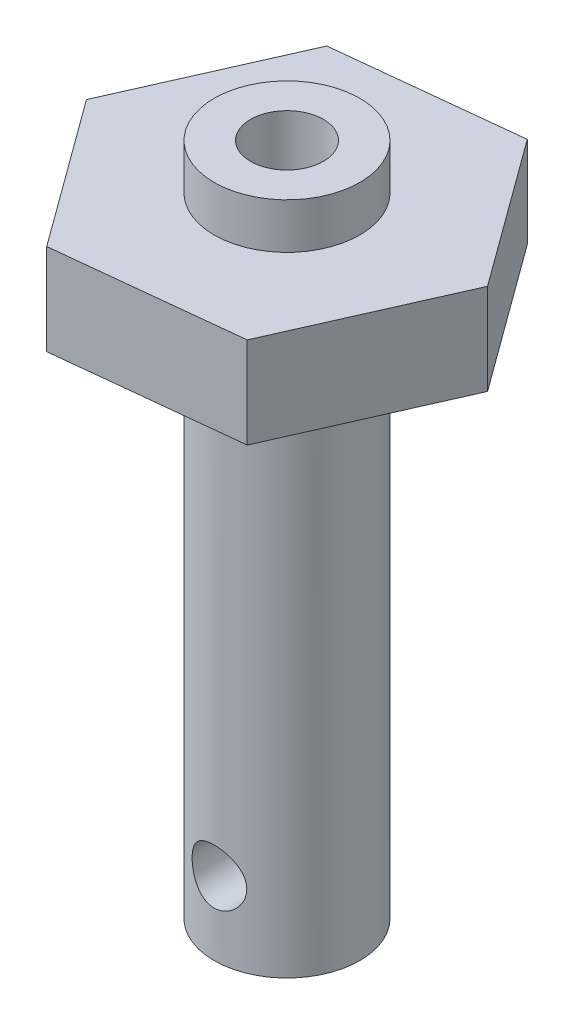
ISO-10303-21;
HEADER;
FILE_DESCRIPTION(('STEP AP214'),'2;1');
FILE_NAME('part.step','',(''),(''),'','','');
FILE_SCHEMA(('AUTOMOTIVE_DESIGN { 1 0 10303 214 1 1 1 1 }'));
ENDSEC;
DATA;
#1=APPLICATION_CONTEXT('core data for automotive mechanical design processes');
#2=APPLICATION_PROTOCOL_DEFINITION('international standard','automotive_design',2000,#1);
#3=PRODUCT_CONTEXT('',#1,'mechanical');
#4=PRODUCT('Part','Part','',(#3));
#5=PRODUCT_RELATED_PRODUCT_CATEGORY('part','',(#4));
#6=PRODUCT_DEFINITION_FORMATION('','',#4);
#7=PRODUCT_DEFINITION_CONTEXT('part definition',#1,'design');
#8=PRODUCT_DEFINITION('design','',#6,#7);
#9=PRODUCT_DEFINITION_SHAPE('','',#8);
#10=(LENGTH_UNIT() NAMED_UNIT(*) SI_UNIT(.MILLI.,.METRE.));
#11=(NAMED_UNIT(*) PLANE_ANGLE_UNIT() SI_UNIT($,.RADIAN.));
#12=(NAMED_UNIT(*) SI_UNIT($,.STERADIAN.) SOLID_ANGLE_UNIT());
#13=UNCERTAINTY_MEASURE_WITH_UNIT(LENGTH_MEASURE(1.E-05),#10,'distance_accuracy_value','');
#14=(GEOMETRIC_REPRESENTATION_CONTEXT(3) GLOBAL_UNCERTAINTY_ASSIGNED_CONTEXT((#13)) GLOBAL_UNIT_ASSIGNED_CONTEXT((#10,
#11,#12)) REPRESENTATION_CONTEXT('',''));
#15=CARTESIAN_POINT('',(0.,0.,0.));
#16=DIRECTION('',(0.,0.,1.));
#17=DIRECTION('',(1.,0.,0.));
#18=AXIS2_PLACEMENT_3D('',#15,#16,#17);
#19=CARTESIAN_POINT('',(0.,8.50000000000005,0.));
#20=DIRECTION('',(0.,1.,0.));
#21=DIRECTION('',(0.,0.,1.));
#22=AXIS2_PLACEMENT_3D('',#19,#20,#21);
#23=CYLINDRICAL_SURFACE('',#22,3.99999999999993);
#24=CARTESIAN_POINT('',(0.,29.5,0.));
#25=DIRECTION('',(0.,-1.,0.));
#26=DIRECTION('',(1.,0.,0.));
#27=AXIS2_PLACEMENT_3D('',#24,#25,#26);
#28=CIRCLE('',#27,3.99999999999993);
#29=CARTESIAN_POINT('',(3.99999999999993,29.5000000000001,0.));
#30=VERTEX_POINT('',#29);
#31=EDGE_CURVE('E12',#30,#30,#28,.F.);
#32=ORIENTED_EDGE('',*,*,#31,.F.);
#33=EDGE_LOOP('',(#32));
#34=FACE_BOUND('',#33,.T.);
#35=CARTESIAN_POINT('',(1.5,4.,-3.70809924354782));
#36=CARTESIAN_POINT('',(1.50000304106109,3.91899251627921,-3.70809640633805));
#37=CARTESIAN_POINT('',(1.49341597549487,3.83800507749636,-3.71078260240985));
#38=CARTESIAN_POINT('',(1.46736187895468,3.6784719170868,-3.72116159304966));
#39=CARTESIAN_POINT('',(1.44789523373263,3.59992612240499,-3.72885423767111));
#40=CARTESIAN_POINT('',(1.39689657610574,3.44762462838647,-3.74825480280899));
#41=CARTESIAN_POINT('',(1.36539347266348,3.37385794334892,-3.75995309569259));
#42=CARTESIAN_POINT('',(1.29131856742698,3.23262810318116,-3.78603134206598));
#43=CARTESIAN_POINT('',(1.24874344095039,3.16516684971748,-3.80041210067322));
#44=CARTESIAN_POINT('',(1.15146661374162,3.03510968837718,-3.83103574665712));
#45=CARTESIAN_POINT('',(1.09630381213306,2.97287147037061,-3.84733341923603));
#46=CARTESIAN_POINT('',(0.976395839778926,2.85827718532851,-3.87949750628546));
#47=CARTESIAN_POINT('',(0.91164863025668,2.80592322625815,-3.89536382814784));
#48=CARTESIAN_POINT('',(0.7716946551776,2.71086048770439,-3.92552873936552));
#49=CARTESIAN_POINT('',(0.696206947538028,2.66854052528414,-3.93975561223505));
#50=CARTESIAN_POINT('',(0.538555771965247,2.59734882747509,-3.96438007973847));
#51=CARTESIAN_POINT('',(0.456394630933536,2.56847242800803,-3.97477900217005));
#52=CARTESIAN_POINT('',(0.291489341676832,2.52624210422538,-3.99018697103439));
#53=CARTESIAN_POINT('',(0.208923197281596,2.51227237255954,-3.99540915214773));
#54=CARTESIAN_POINT('',(0.0424643637947859,2.49827879905501,-4.00064014107939));
#55=CARTESIAN_POINT('',(-0.0414278850628332,2.49825042238129,-4.00065064414901));
#56=CARTESIAN_POINT('',(-0.203743543064476,2.51178176146517,-3.99559265903893));
#57=CARTESIAN_POINT('',(-0.2822321782669,2.52466929794881,-3.99077541996682));
#58=CARTESIAN_POINT('',(-0.435839217984391,2.56253591522555,-3.97693274932262));
#59=CARTESIAN_POINT('',(-0.510957383430299,2.58751585226204,-3.96790701975577));
#60=CARTESIAN_POINT('',(-0.656989017303104,2.64917045167585,-3.9463776916753));
#61=CARTESIAN_POINT('',(-0.727825392287309,2.68601000526841,-3.93382539470076));
#62=CARTESIAN_POINT('',(-0.862486607957559,2.77019209692939,-3.90651310225278));
#63=CARTESIAN_POINT('',(-0.926309176932323,2.8175380230176,-3.89175239512839));
#64=CARTESIAN_POINT('',(-1.04909048680094,2.92462728628319,-3.86052529655815));
#65=CARTESIAN_POINT('',(-1.10754614526348,2.98493391565043,-3.84400963763882));
#66=CARTESIAN_POINT('',(-1.21370395569342,3.11459299332156,-3.81182460645721));
#67=CARTESIAN_POINT('',(-1.261403406929,3.18394770658664,-3.79615544748846));
#68=CARTESIAN_POINT('',(-1.34565611808152,3.33171946746282,-3.76712703500335));
#69=CARTESIAN_POINT('',(-1.38193847851831,3.41030349368607,-3.75382677150276));
#70=CARTESIAN_POINT('',(-1.44056464441501,3.57309622516757,-3.73172438629002));
#71=CARTESIAN_POINT('',(-1.46291620605595,3.65730177159369,-3.72291976205782));
#72=CARTESIAN_POINT('',(-1.49190191709668,3.82397596231595,-3.71139597222848));
#73=CARTESIAN_POINT('',(-1.49933521158966,3.90628410553614,-3.70836785241536));
#74=CARTESIAN_POINT('',(-1.50057885636272,4.07100935674174,-3.70786539525015));
#75=CARTESIAN_POINT('',(-1.49439261093762,4.15342643235247,-3.71038967003986));
#76=CARTESIAN_POINT('',(-1.46929733520157,4.31192992228768,-3.72039381629734));
#77=CARTESIAN_POINT('',(-1.45100618334225,4.38813113576466,-3.72763276216448));
#78=CARTESIAN_POINT('',(-1.40299774640637,4.5363479447202,-3.74596487046361));
#79=CARTESIAN_POINT('',(-1.37327812034623,4.60836267916814,-3.75705882250172));
#80=CARTESIAN_POINT('',(-1.30200292275278,4.74916443807621,-3.78236243116079));
#81=CARTESIAN_POINT('',(-1.26004545177047,4.81772929213734,-3.79667328892064));
#82=CARTESIAN_POINT('',(-1.16591317862479,4.94712898172604,-3.8266281429429));
#83=CARTESIAN_POINT('',(-1.11373463696435,5.00796097462463,-3.84227262594076));
#84=CARTESIAN_POINT('',(-0.996727340900938,5.1241683731951,-3.87433046553183));
#85=CARTESIAN_POINT('',(-0.931306341491061,5.17895340876875,-3.89072969357027));
#86=CARTESIAN_POINT('',(-0.79179747175315,5.27683836758944,-3.92149874963301));
#87=CARTESIAN_POINT('',(-0.717709573322673,5.31993825294584,-3.93586857107663));
#88=CARTESIAN_POINT('',(-0.563016329468476,5.39294605619961,-3.96094985704551));
#89=CARTESIAN_POINT('',(-0.482434433064626,5.4228991237926,-3.97167381338009));
#90=CARTESIAN_POINT('',(-0.316881887523255,5.46865641384992,-3.9882943671257));
#91=CARTESIAN_POINT('',(-0.231913320723592,5.4844672854224,-3.99419323299412));
#92=CARTESIAN_POINT('',(-0.0653355852738149,5.50077440275483,-4.00028407317073));
#93=CARTESIAN_POINT('',(0.016180768060846,5.50210948305899,-4.00078860953763));
#94=CARTESIAN_POINT('',(0.178226786412424,5.49158484055461,-3.99684889809223));
#95=CARTESIAN_POINT('',(0.258756569245258,5.47972670911414,-3.99240524713129));
#96=CARTESIAN_POINT('',(0.414548248377126,5.44374114850638,-3.9792108960377));
#97=CARTESIAN_POINT('',(0.489890731068835,5.41992009412164,-3.97056791378017));
#98=CARTESIAN_POINT('',(0.63551547300639,5.36098998661564,-3.94987783620989));
#99=CARTESIAN_POINT('',(0.705796771275543,5.32587879669525,-3.93783009655663));
#100=CARTESIAN_POINT('',(0.842540176994413,5.24368605649519,-3.91090618300073));
#101=CARTESIAN_POINT('',(0.90871754884685,5.19616335948585,-3.89593240108828));
#102=CARTESIAN_POINT('',(1.03241734752336,5.09119216981239,-3.86499507694843));
#103=CARTESIAN_POINT('',(1.0899366712559,5.03374013419213,-3.84903118274026));
#104=CARTESIAN_POINT('',(1.19781214236196,4.90693586835494,-3.81688129739174));
#105=CARTESIAN_POINT('',(1.24762999816025,4.83711559784569,-3.80072805349159));
#106=CARTESIAN_POINT('',(1.33484709556843,4.68958413042667,-3.77098325003637));
#107=CARTESIAN_POINT('',(1.37224504878157,4.61187211594652,-3.75739195631216));
#108=CARTESIAN_POINT('',(1.4346588697426,4.44704431902459,-3.73402269853265));
#109=CARTESIAN_POINT('',(1.45906002899523,4.35966563348821,-3.72443803290859));
#110=CARTESIAN_POINT('',(1.49172356722079,4.18151472804421,-3.71147994336314));
#111=CARTESIAN_POINT('',(1.49999659339571,4.09074478729001,-3.70810242179735));
#112=CARTESIAN_POINT('',(1.5,4.,-3.70809924354782));
#113=B_SPLINE_CURVE_WITH_KNOTS('',3,(#35,#36,#37,#38,#39,#40,#41,#42,#43,#44,#45,#46,#47,#48,
#49,#50,#51,#52,#53,#54,#55,#56,#57,#58,#59,#60,#61,#62,#63,#64,#65,#66,#67,#68,#69,#70,#71,#72,
#73,#74,#75,#76,#77,#78,#79,#80,#81,#82,#83,#84,#85,#86,#87,#88,#89,#90,#91,#92,#93,#94,#95,#96,
#97,#98,#99,#100,#101,#102,#103,#104,#105,#106,#107,#108,#109,#110,#111,#112),.UNSPECIFIED.,.T.,
.F.,(4,2,2,2,2,2,2,2,2,2,2,2,2,2,2,2,2,2,2,2,2,2,2,2,2,2,2,2,2,2,2,2,2,2,2,2,2,2,4),(0.,
0.24268454141617,0.485361814598854,0.72745985675703,0.969630679682933,1.22274652401128,
1.47591628822983,1.73770072136421,1.9993942638133,2.24980018489679,2.50012465404857,
2.73806472803194,2.97602165263335,3.21744131210668,3.45893893628976,3.71456675065874,
3.97025867827335,4.23162592252966,4.49284751635474,4.73965657740485,4.98640395388884,
5.22143845928199,5.45652113429526,5.70041561005821,5.94439948466355,6.20385016993624,
6.46330169650178,6.72185508890168,6.98028685560127,7.22365720549936,7.4669982031948,
7.7044027400389,7.94185223512831,8.18928323676987,8.43680270894964,8.69738599542079,
8.95799630544242,9.23003178870926,9.50188762323053),.UNSPECIFIED.);
#114=CARTESIAN_POINT('',(1.5,4.,-3.70809924354782));
#115=VERTEX_POINT('',#114);
#116=EDGE_CURVE('E177',#115,#115,#113,.T.);
#117=ORIENTED_EDGE('',*,*,#116,.F.);
#118=EDGE_LOOP('',(#117));
#119=FACE_BOUND('',#118,.T.);
#120=CARTESIAN_POINT('',(1.5,4.,3.70809924354783));
#121=CARTESIAN_POINT('',(1.50000304106109,4.08100748372079,3.70809640633806));
#122=CARTESIAN_POINT('',(1.49341597549487,4.16199492250364,3.71078260240986));
#123=CARTESIAN_POINT('',(1.46736187895468,4.3215280829132,3.72116159304967));
#124=CARTESIAN_POINT('',(1.44789523373263,4.40007387759501,3.72885423767112));
#125=CARTESIAN_POINT('',(1.39689657610574,4.55237537161353,3.748254802809));
#126=CARTESIAN_POINT('',(1.36539347266348,4.62614205665108,3.7599530956926));
#127=CARTESIAN_POINT('',(1.29131856742698,4.76737189681884,3.78603134206598));
#128=CARTESIAN_POINT('',(1.24874344095039,4.83483315028252,3.80041210067323));
#129=CARTESIAN_POINT('',(1.15146661374162,4.96489031162282,3.83103574665713));
#130=CARTESIAN_POINT('',(1.09630381213306,5.02712852962939,3.84733341923603));
#131=CARTESIAN_POINT('',(0.976395839778926,5.14172281467149,3.87949750628547));
#132=CARTESIAN_POINT('',(0.911648630256679,5.19407677374186,3.89536382814785));
#133=CARTESIAN_POINT('',(0.771694655177599,5.28913951229561,3.92552873936553));
#134=CARTESIAN_POINT('',(0.696206947538027,5.33145947471586,3.93975561223505));
#135=CARTESIAN_POINT('',(0.538555771965246,5.40265117252491,3.96438007973847));
#136=CARTESIAN_POINT('',(0.456394630933535,5.43152757199197,3.97477900217006));
#137=CARTESIAN_POINT('',(0.291489341676831,5.47375789577462,3.99018697103439));
#138=CARTESIAN_POINT('',(0.208923197281595,5.48772762744046,3.99540915214774));
#139=CARTESIAN_POINT('',(0.0424643637947849,5.50172120094499,4.0006401410794));
#140=CARTESIAN_POINT('',(-0.0414278850628341,5.50174957761871,4.00065064414902));
#141=CARTESIAN_POINT('',(-0.203743543064477,5.48821823853483,3.99559265903894));
#142=CARTESIAN_POINT('',(-0.282232178266901,5.47533070205118,3.99077541996683));
#143=CARTESIAN_POINT('',(-0.435839217984392,5.43746408477445,3.97693274932263));
#144=CARTESIAN_POINT('',(-0.510957383430299,5.41248414773796,3.96790701975577));
#145=CARTESIAN_POINT('',(-0.656989017303105,5.35082954832415,3.9463776916753));
#146=CARTESIAN_POINT('',(-0.72782539228731,5.31398999473159,3.93382539470077));
#147=CARTESIAN_POINT('',(-0.86248660795756,5.22980790307061,3.90651310225279));
#148=CARTESIAN_POINT('',(-0.926309176932323,5.1824619769824,3.8917523951284));
#149=CARTESIAN_POINT('',(-1.04909048680094,5.07537271371681,3.86052529655816));
#150=CARTESIAN_POINT('',(-1.10754614526348,5.01506608434957,3.84400963763882));
#151=CARTESIAN_POINT('',(-1.21370395569342,4.88540700667844,3.81182460645722));
#152=CARTESIAN_POINT('',(-1.261403406929,4.81605229341336,3.79615544748847));
#153=CARTESIAN_POINT('',(-1.34565611808152,4.66828053253718,3.76712703500335));
#154=CARTESIAN_POINT('',(-1.38193847851831,4.58969650631393,3.75382677150276));
#155=CARTESIAN_POINT('',(-1.44056464441501,4.42690377483243,3.73172438629002));
#156=CARTESIAN_POINT('',(-1.46291620605595,4.34269822840631,3.72291976205783));
#157=CARTESIAN_POINT('',(-1.49190191709668,4.17602403768405,3.71139597222848));
#158=CARTESIAN_POINT('',(-1.49933521158966,4.09371589446386,3.70836785241537));
#159=CARTESIAN_POINT('',(-1.50057885636272,3.92899064325826,3.70786539525016));
#160=CARTESIAN_POINT('',(-1.49439261093762,3.84657356764753,3.71038967003986));
#161=CARTESIAN_POINT('',(-1.46929733520157,3.68807007771232,3.72039381629735));
#162=CARTESIAN_POINT('',(-1.45100618334225,3.61186886423534,3.72763276216449));
#163=CARTESIAN_POINT('',(-1.40299774640637,3.46365205527981,3.74596487046362));
#164=CARTESIAN_POINT('',(-1.37327812034623,3.39163732083186,3.75705882250173));
#165=CARTESIAN_POINT('',(-1.30200292275278,3.25083556192379,3.78236243116079));
#166=CARTESIAN_POINT('',(-1.26004545177047,3.18227070786266,3.79667328892065));
#167=CARTESIAN_POINT('',(-1.16591317862479,3.05287101827396,3.82662814294291));
#168=CARTESIAN_POINT('',(-1.11373463696435,2.99203902537537,3.84227262594077));
#169=CARTESIAN_POINT('',(-0.996727340900938,2.8758316268049,3.87433046553184));
#170=CARTESIAN_POINT('',(-0.931306341491061,2.82104659123125,3.89072969357027));
#171=CARTESIAN_POINT('',(-0.791797471753151,2.72316163241056,3.92149874963302));
#172=CARTESIAN_POINT('',(-0.717709573322673,2.68006174705416,3.93586857107664));
#173=CARTESIAN_POINT('',(-0.563016329468477,2.60705394380039,3.96094985704552));
#174=CARTESIAN_POINT('',(-0.482434433064626,2.5771008762074,3.9716738133801));
#175=CARTESIAN_POINT('',(-0.316881887523254,2.53134358615008,3.98829436712571));
#176=CARTESIAN_POINT('',(-0.231913320723593,2.5155327145776,3.99419323299412));
#177=CARTESIAN_POINT('',(-0.0653355852738154,2.49922559724517,4.00028407317073));
#178=CARTESIAN_POINT('',(0.0161807680608454,2.49789051694101,4.00078860953764));
#179=CARTESIAN_POINT('',(0.178226786412424,2.50841515944539,3.99684889809223));
#180=CARTESIAN_POINT('',(0.258756569245257,2.52027329088586,3.9924052471313));
#181=CARTESIAN_POINT('',(0.414548248377126,2.55625885149362,3.97921089603771));
#182=CARTESIAN_POINT('',(0.489890731068834,2.58007990587836,3.97056791378017));
#183=CARTESIAN_POINT('',(0.63551547300639,2.63901001338436,3.9498778362099));
#184=CARTESIAN_POINT('',(0.705796771275542,2.67412120330475,3.93783009655664));
#185=CARTESIAN_POINT('',(0.842540176994412,2.75631394350481,3.91090618300074));
#186=CARTESIAN_POINT('',(0.908717548846849,2.80383664051415,3.89593240108828));
#187=CARTESIAN_POINT('',(1.03241734752336,2.9088078301876,3.86499507694844));
#188=CARTESIAN_POINT('',(1.0899366712559,2.96625986580787,3.84903118274027));
#189=CARTESIAN_POINT('',(1.19781214236196,3.09306413164506,3.81688129739175));
#190=CARTESIAN_POINT('',(1.24762999816025,3.16288440215431,3.8007280534916));
#191=CARTESIAN_POINT('',(1.33484709556843,3.31041586957333,3.77098325003638));
#192=CARTESIAN_POINT('',(1.37224504878157,3.38812788405348,3.75739195631216));
#193=CARTESIAN_POINT('',(1.4346588697426,3.55295568097541,3.73402269853266));
#194=CARTESIAN_POINT('',(1.45906002899523,3.64033436651178,3.7244380329086));
#195=CARTESIAN_POINT('',(1.49172356722079,3.81848527195579,3.71147994336315));
#196=CARTESIAN_POINT('',(1.49999659339571,3.90925521270999,3.70810242179736));
#197=CARTESIAN_POINT('',(1.5,4.,3.70809924354783));
#198=B_SPLINE_CURVE_WITH_KNOTS('',3,(#120,#121,#122,#123,#124,#125,#126,#127,#128,#129,#130,
#131,#132,#133,#134,#135,#136,#137,#138,#139,#140,#141,#142,#143,#144,#145,#146,#147,#148,#149,
#150,#151,#152,#153,#154,#155,#156,#157,#158,#159,#160,#161,#162,#163,#164,#165,#166,#167,#168,
#169,#170,#171,#172,#173,#174,#175,#176,#177,#178,#179,#180,#181,#182,#183,#184,#185,#186,#187,
#188,#189,#190,#191,#192,#193,#194,#195,#196,#197),.UNSPECIFIED.,.T.,.F.,(4,2,2,2,2,2,2,2,2,2,2,
2,2,2,2,2,2,2,2,2,2,2,2,2,2,2,2,2,2,2,2,2,2,2,2,2,2,2,4),(0.,0.24268454141617,0.485361814598855,
0.727459856757031,0.969630679682934,1.22274652401128,1.47591628822983,1.73770072136421,
1.9993942638133,2.24980018489679,2.50012465404857,2.73806472803194,2.97602165263335,
3.21744131210668,3.45893893628976,3.71456675065874,3.97025867827335,4.23162592252966,
4.49284751635474,4.73965657740485,4.98640395388884,5.22143845928199,5.45652113429526,
5.70041561005821,5.94439948466355,6.20385016993624,6.46330169650178,6.72185508890169,
6.98028685560127,7.22365720549936,7.4669982031948,7.70440274003891,7.94185223512831,
8.18928323676987,8.43680270894965,8.69738599542079,8.95799630544242,9.23003178870926,
9.50188762323053),.UNSPECIFIED.);
#199=CARTESIAN_POINT('',(1.5,4.,3.70809924354783));
#200=VERTEX_POINT('',#199);
#201=EDGE_CURVE('E180',#200,#200,#198,.T.);
#202=ORIENTED_EDGE('',*,*,#201,.F.);
#203=EDGE_LOOP('',(#202));
#204=FACE_BOUND('',#203,.T.);
#205=CARTESIAN_POINT('',(0.,0.,0.));
#206=DIRECTION('',(0.,1.,0.));
#207=DIRECTION('',(0.,0.,1.));
#208=AXIS2_PLACEMENT_3D('',#205,#206,#207);
#209=CIRCLE('',#208,4.);
#210=CARTESIAN_POINT('',(0.,0.,4.));
#211=VERTEX_POINT('',#210);
#212=EDGE_CURVE('E186',#211,#211,#209,.T.);
#213=ORIENTED_EDGE('',*,*,#212,.T.);
#214=EDGE_LOOP('',(#213));
#215=FACE_BOUND('',#214,.T.);
#216=ADVANCED_FACE('F33',(#34,#119,#204,#215),#23,.T.);
#217=CARTESIAN_POINT('',(5.8949322334674,2.48324532484363,8.07773321933895));
#218=DIRECTION('',(-0.106629445810112,0.,-0.994298828967544));
#219=DIRECTION('',(-0.994298828967544,0.,0.106629445810112));
#220=AXIS2_PLACEMENT_3D('',#217,#218,#219);
#221=PLANE('',#220);
#222=DIRECTION('',(-0.994298828967544,0.,0.106629445810112));
#223=VECTOR('',#222,1.);
#224=CARTESIAN_POINT('',(5.89493223346735,29.5000000000001,8.07773321933897));
#225=LINE('',#224,#223);
#226=CARTESIAN_POINT('',(5.89493223346741,29.5000000000001,8.07773321933896));
#227=VERTEX_POINT('',#226);
#228=CARTESIAN_POINT('',(-4.04805605620728,29.5,9.14402767744));
#229=VERTEX_POINT('',#228);
#230=EDGE_CURVE('E144',#227,#229,#225,.T.);
#231=ORIENTED_EDGE('',*,*,#230,.F.);
#232=DIRECTION('',(0.,1.,0.));
#233=VECTOR('',#232,1.);
#234=CARTESIAN_POINT('',(5.8949322334674,2.48324532484363,8.07773321933895));
#235=LINE('',#234,#233);
#236=CARTESIAN_POINT('',(5.8949322334674,34.5,8.07773321933896));
#237=VERTEX_POINT('',#236);
#238=EDGE_CURVE('E131',#227,#237,#235,.T.);
#239=ORIENTED_EDGE('',*,*,#238,.T.);
#240=DIRECTION('',(-0.994298828967544,0.,0.106629445810112));
#241=VECTOR('',#240,1.);
#242=CARTESIAN_POINT('',(5.8949322334674,34.5,8.07773321933896));
#243=LINE('',#242,#241);
#244=CARTESIAN_POINT('',(-4.04805605620728,34.5,9.14402767744));
#245=VERTEX_POINT('',#244);
#246=EDGE_CURVE('E99',#237,#245,#243,.T.);
#247=ORIENTED_EDGE('',*,*,#246,.T.);
#248=DIRECTION('',(0.,1.,0.));
#249=VECTOR('',#248,1.);
#250=CARTESIAN_POINT('',(-4.04805605620728,2.48324532484363,9.14402767743999));
#251=LINE('',#250,#249);
#252=EDGE_CURVE('E129',#229,#245,#251,.T.);
#253=ORIENTED_EDGE('',*,*,#252,.F.);
#254=EDGE_LOOP('',(#231,#239,#247,#253));
#255=FACE_BOUND('',#254,.T.);
#256=ADVANCED_FACE('F234',(#255),#221,.F.);
#257=CARTESIAN_POINT('',(-4.04805605620728,2.48324532484363,9.14402767743999));
#258=DIRECTION('',(0.807773321933956,0.,-0.589493223346785));
#259=DIRECTION('',(-0.589493223346785,0.,-0.807773321933956));
#260=AXIS2_PLACEMENT_3D('',#257,#258,#259);
#261=PLANE('',#260);
#262=DIRECTION('',(-0.589493223346785,0.,-0.807773321933956));
#263=VECTOR('',#262,1.);
#264=CARTESIAN_POINT('',(-4.0480560562073,29.5,9.14402767743997));
#265=LINE('',#264,#263);
#266=CARTESIAN_POINT('',(-9.94298828967469,29.5,1.06629445810105));
#267=VERTEX_POINT('',#266);
#268=EDGE_CURVE('E141',#229,#267,#265,.T.);
#269=ORIENTED_EDGE('',*,*,#268,.F.);
#270=ORIENTED_EDGE('',*,*,#252,.T.);
#271=DIRECTION('',(-0.589493223346785,0.,-0.807773321933956));
#272=VECTOR('',#271,1.);
#273=CARTESIAN_POINT('',(-4.04805605620728,34.5,9.14402767744));
#274=LINE('',#273,#272);
#275=CARTESIAN_POINT('',(-9.94298828967469,34.5,1.06629445810105));
#276=VERTEX_POINT('',#275);
#277=EDGE_CURVE('E126',#245,#276,#274,.T.);
#278=ORIENTED_EDGE('',*,*,#277,.T.);
#279=DIRECTION('',(0.,1.,0.));
#280=VECTOR('',#279,1.);
#281=CARTESIAN_POINT('',(-9.94298828967469,2.48324532484363,1.06629445810104));
#282=LINE('',#281,#280);
#283=EDGE_CURVE('E125',#267,#276,#282,.T.);
#284=ORIENTED_EDGE('',*,*,#283,.F.);
#285=EDGE_LOOP('',(#269,#270,#278,#284));
#286=FACE_BOUND('',#285,.T.);
#287=ADVANCED_FACE('F230',(#286),#261,.F.);
#288=CARTESIAN_POINT('',(-9.94298828967469,2.48324532484363,1.06629445810104));
#289=DIRECTION('',(0.914402767744067,0.,0.404805605620759));
#290=DIRECTION('',(0.404805605620759,0.,-0.914402767744067));
#291=AXIS2_PLACEMENT_3D('',#288,#289,#290);
#292=PLANE('',#291);
#293=DIRECTION('',(0.404805605620759,0.,-0.914402767744067));
#294=VECTOR('',#293,1.);
#295=CARTESIAN_POINT('',(-9.9429882896747,29.5,1.06629445810106));
#296=LINE('',#295,#294);
#297=CARTESIAN_POINT('',(-5.89493223346741,29.5,-8.07773321933894));
#298=VERTEX_POINT('',#297);
#299=EDGE_CURVE('E138',#267,#298,#296,.T.);
#300=ORIENTED_EDGE('',*,*,#299,.F.);
#301=ORIENTED_EDGE('',*,*,#283,.T.);
#302=DIRECTION('',(0.404805605620759,0.,-0.914402767744067));
#303=VECTOR('',#302,1.);
#304=CARTESIAN_POINT('',(-9.94298828967469,34.5,1.06629445810105));
#305=LINE('',#304,#303);
#306=CARTESIAN_POINT('',(-5.89493223346741,34.5,-8.07773321933894));
#307=VERTEX_POINT('',#306);
#308=EDGE_CURVE('E122',#276,#307,#305,.T.);
#309=ORIENTED_EDGE('',*,*,#308,.T.);
#310=DIRECTION('',(0.,1.,0.));
#311=VECTOR('',#310,1.);
#312=CARTESIAN_POINT('',(-5.89493223346741,2.48324532484363,-8.07773321933894));
#313=LINE('',#312,#311);
#314=EDGE_CURVE('E121',#298,#307,#313,.T.);
#315=ORIENTED_EDGE('',*,*,#314,.F.);
#316=EDGE_LOOP('',(#300,#301,#309,#315));
#317=FACE_BOUND('',#316,.T.);
#318=ADVANCED_FACE('F226',(#317),#292,.F.);
#319=CARTESIAN_POINT('',(-5.89493223346741,2.48324532484363,-8.07773321933894));
#320=DIRECTION('',(0.106629445810112,0.,0.994298828967544));
#321=DIRECTION('',(0.994298828967544,0.,-0.106629445810112));
#322=AXIS2_PLACEMENT_3D('',#319,#320,#321);
#323=PLANE('',#322);
#324=DIRECTION('',(0.994298828967544,0.,-0.106629445810112));
#325=VECTOR('',#324,1.);
#326=CARTESIAN_POINT('',(-5.89493223346746,29.5,-8.07773321933893));
#327=LINE('',#326,#325);
#328=CARTESIAN_POINT('',(4.04805605620728,29.5000000000001,-9.14402767743998));
#329=VERTEX_POINT('',#328);
#330=EDGE_CURVE('E135',#298,#329,#327,.T.);
#331=ORIENTED_EDGE('',*,*,#330,.F.);
#332=ORIENTED_EDGE('',*,*,#314,.T.);
#333=DIRECTION('',(0.994298828967544,0.,-0.106629445810112));
#334=VECTOR('',#333,1.);
#335=CARTESIAN_POINT('',(-5.89493223346741,34.5,-8.07773321933894));
#336=LINE('',#335,#334);
#337=CARTESIAN_POINT('',(4.04805605620728,34.5,-9.14402767743998));
#338=VERTEX_POINT('',#337);
#339=EDGE_CURVE('E116',#307,#338,#336,.T.);
#340=ORIENTED_EDGE('',*,*,#339,.T.);
#341=DIRECTION('',(0.,1.,0.));
#342=VECTOR('',#341,1.);
#343=CARTESIAN_POINT('',(4.04805605620728,2.48324532484363,-9.14402767743998));
#344=LINE('',#343,#342);
#345=EDGE_CURVE('E113',#329,#338,#344,.T.);
#346=ORIENTED_EDGE('',*,*,#345,.F.);
#347=EDGE_LOOP('',(#331,#332,#340,#346));
#348=FACE_BOUND('',#347,.T.);
#349=ADVANCED_FACE('F223',(#348),#323,.F.);
#350=CARTESIAN_POINT('',(4.04805605620728,2.48324532484363,-9.14402767743998));
#351=DIRECTION('',(-0.807773321933955,0.,0.589493223346785));
#352=DIRECTION('',(0.589493223346785,0.,0.807773321933955));
#353=AXIS2_PLACEMENT_3D('',#350,#351,#352);
#354=PLANE('',#353);
#355=DIRECTION('',(0.589493223346785,0.,0.807773321933955));
#356=VECTOR('',#355,1.);
#357=CARTESIAN_POINT('',(4.04805605620726,29.5000000000001,-9.14402767744001));
#358=LINE('',#357,#356);
#359=CARTESIAN_POINT('',(9.94298828967469,29.5000000000001,-1.06629445810103));
#360=VERTEX_POINT('',#359);
#361=EDGE_CURVE('E132',#329,#360,#358,.T.);
#362=ORIENTED_EDGE('',*,*,#361,.F.);
#363=ORIENTED_EDGE('',*,*,#345,.T.);
#364=DIRECTION('',(0.589493223346785,0.,0.807773321933955));
#365=VECTOR('',#364,1.);
#366=CARTESIAN_POINT('',(4.04805605620728,34.5,-9.14402767743998));
#367=LINE('',#366,#365);
#368=CARTESIAN_POINT('',(9.94298828967469,34.5,-1.06629445810103));
#369=VERTEX_POINT('',#368);
#370=EDGE_CURVE('E96',#338,#369,#367,.T.);
#371=ORIENTED_EDGE('',*,*,#370,.T.);
#372=DIRECTION('',(0.,1.,0.));
#373=VECTOR('',#372,1.);
#374=CARTESIAN_POINT('',(9.94298828967469,2.48324532484363,-1.06629445810104));
#375=LINE('',#374,#373);
#376=EDGE_CURVE('E103',#360,#369,#375,.T.);
#377=ORIENTED_EDGE('',*,*,#376,.F.);
#378=EDGE_LOOP('',(#362,#363,#371,#377));
#379=FACE_BOUND('',#378,.T.);
#380=ADVANCED_FACE('F111',(#379),#354,.F.);
#381=CARTESIAN_POINT('',(9.94298828967469,2.48324532484363,-1.06629445810104));
#382=DIRECTION('',(-0.914402767744067,0.,-0.404805605620758));
#383=DIRECTION('',(-0.404805605620759,0.,0.914402767744068));
#384=AXIS2_PLACEMENT_3D('',#381,#382,#383);
#385=PLANE('',#384);
#386=DIRECTION('',(-0.404805605620759,0.,0.914402767744068));
#387=VECTOR('',#386,1.);
#388=CARTESIAN_POINT('',(9.94298828967468,29.5000000000001,-1.06629445810101));
#389=LINE('',#388,#387);
#390=EDGE_CURVE('E102',#360,#227,#389,.T.);
#391=ORIENTED_EDGE('',*,*,#390,.F.);
#392=ORIENTED_EDGE('',*,*,#376,.T.);
#393=DIRECTION('',(-0.404805605620758,0.,0.914402767744067));
#394=VECTOR('',#393,1.);
#395=CARTESIAN_POINT('',(9.94298828967469,34.5,-1.06629445810103));
#396=LINE('',#395,#394);
#397=EDGE_CURVE('E92',#369,#237,#396,.T.);
#398=ORIENTED_EDGE('',*,*,#397,.T.);
#399=ORIENTED_EDGE('',*,*,#238,.F.);
#400=EDGE_LOOP('',(#391,#392,#398,#399));
#401=FACE_BOUND('',#400,.T.);
#402=ADVANCED_FACE('F106',(#401),#385,.F.);
#403=CARTESIAN_POINT('',(-1.56015470067894E-13,29.5,0.));
#404=DIRECTION('',(0.,-1.,0.));
#405=DIRECTION('',(-0.000307181244364815,0.,-0.999999952819841));
#406=AXIS2_PLACEMENT_3D('',#403,#404,#405);
#407=PLANE('',#406);
#408=ORIENTED_EDGE('',*,*,#31,.T.);
#409=EDGE_LOOP('',(#408));
#410=FACE_BOUND('',#409,.T.);
#411=ORIENTED_EDGE('',*,*,#390,.T.);
#412=ORIENTED_EDGE('',*,*,#230,.T.);
#413=ORIENTED_EDGE('',*,*,#268,.T.);
#414=ORIENTED_EDGE('',*,*,#299,.T.);
#415=ORIENTED_EDGE('',*,*,#330,.T.);
#416=ORIENTED_EDGE('',*,*,#361,.T.);
#417=EDGE_LOOP('',(#411,#412,#413,#414,#415,#416));
#418=FACE_BOUND('',#417,.T.);
#419=ADVANCED_FACE('F217',(#410,#418),#407,.T.);
#420=CARTESIAN_POINT('',(0.,34.5,0.));
#421=DIRECTION('',(0.,1.,0.));
#422=DIRECTION('',(0.,0.,1.));
#423=AXIS2_PLACEMENT_3D('',#420,#421,#422);
#424=PLANE('',#423);
#425=CARTESIAN_POINT('',(1.5999747025505E-13,34.5,-7.11107768992613E-13));
#426=DIRECTION('',(0.,1.,0.));
#427=DIRECTION('',(0.,0.,1.));
#428=AXIS2_PLACEMENT_3D('',#425,#426,#427);
#429=CIRCLE('',#428,4.);
#430=CARTESIAN_POINT('',(1.5999747025505E-13,34.5,3.99999999999929));
#431=VERTEX_POINT('',#430);
#432=EDGE_CURVE('E155',#431,#431,#429,.T.);
#433=ORIENTED_EDGE('',*,*,#432,.F.);
#434=EDGE_LOOP('',(#433));
#435=FACE_BOUND('',#434,.T.);
#436=ORIENTED_EDGE('',*,*,#246,.F.);
#437=ORIENTED_EDGE('',*,*,#397,.F.);
#438=ORIENTED_EDGE('',*,*,#370,.F.);
#439=ORIENTED_EDGE('',*,*,#339,.F.);
#440=ORIENTED_EDGE('',*,*,#308,.F.);
#441=ORIENTED_EDGE('',*,*,#277,.F.);
#442=EDGE_LOOP('',(#436,#437,#438,#439,#440,#441));
#443=FACE_BOUND('',#442,.T.);
#444=ADVANCED_FACE('F94',(#435,#443),#424,.T.);
#445=CARTESIAN_POINT('',(1.5999747025505E-13,34.5,-7.11107768992613E-13));
#446=DIRECTION('',(0.,1.,0.));
#447=DIRECTION('',(0.,0.,1.));
#448=AXIS2_PLACEMENT_3D('',#445,#446,#447);
#449=CYLINDRICAL_SURFACE('',#448,4.);
#450=ORIENTED_EDGE('',*,*,#432,.T.);
#451=EDGE_LOOP('',(#450));
#452=FACE_BOUND('',#451,.T.);
#453=CARTESIAN_POINT('',(1.59999638659395E-13,37.,-7.10690811306969E-13));
#454=DIRECTION('',(0.,1.,0.));
#455=DIRECTION('',(0.,0.,1.));
#456=AXIS2_PLACEMENT_3D('',#453,#454,#455);
#457=CIRCLE('',#456,4.);
#458=CARTESIAN_POINT('',(1.59999638659395E-13,37.,3.99999999999929));
#459=VERTEX_POINT('',#458);
#460=EDGE_CURVE('E274',#459,#459,#457,.T.);
#461=ORIENTED_EDGE('',*,*,#460,.F.);
#462=EDGE_LOOP('',(#461));
#463=FACE_BOUND('',#462,.T.);
#464=ADVANCED_FACE('F211',(#452,#463),#449,.T.);
#465=CARTESIAN_POINT('',(-1.71404777973794E-13,37.,0.));
#466=DIRECTION('',(0.,-1.,0.));
#467=DIRECTION('',(-0.000307181244364815,0.,-0.999999952819841));
#468=AXIS2_PLACEMENT_3D('',#465,#466,#467);
#469=PLANE('',#468);
#470=CARTESIAN_POINT('',(1.59999638659395E-13,37.,-7.10690811306969E-13));
#471=DIRECTION('',(0.,1.,0.));
#472=DIRECTION('',(0.,0.,1.));
#473=AXIS2_PLACEMENT_3D('',#470,#471,#472);
#474=CIRCLE('',#473,2.);
#475=CARTESIAN_POINT('',(1.59999638659395E-13,37.,1.99999999999929));
#476=VERTEX_POINT('',#475);
#477=EDGE_CURVE('E179',#476,#476,#474,.T.);
#478=ORIENTED_EDGE('',*,*,#477,.F.);
#479=EDGE_LOOP('',(#478));
#480=FACE_BOUND('',#479,.T.);
#481=ORIENTED_EDGE('',*,*,#460,.T.);
#482=EDGE_LOOP('',(#481));
#483=FACE_BOUND('',#482,.T.);
#484=ADVANCED_FACE('F209',(#480,#483),#469,.F.);
#485=CARTESIAN_POINT('',(1.59992699765491E-13,29.,-7.12025075901032E-13));
#486=DIRECTION('',(0.,1.,0.));
#487=DIRECTION('',(0.,0.,1.));
#488=AXIS2_PLACEMENT_3D('',#485,#486,#487);
#489=CYLINDRICAL_SURFACE('',#488,2.);
#490=CARTESIAN_POINT('',(1.59992699765491E-13,29.,-7.12025075901032E-13));
#491=DIRECTION('',(0.,1.,0.));
#492=DIRECTION('',(0.,0.,1.));
#493=AXIS2_PLACEMENT_3D('',#490,#491,#492);
#494=CIRCLE('',#493,2.);
#495=CARTESIAN_POINT('',(1.59992699765491E-13,29.,1.99999999999929));
#496=VERTEX_POINT('',#495);
#497=EDGE_CURVE('E183',#496,#496,#494,.T.);
#498=ORIENTED_EDGE('',*,*,#497,.F.);
#499=EDGE_LOOP('',(#498));
#500=FACE_BOUND('',#499,.T.);
#501=ORIENTED_EDGE('',*,*,#477,.T.);
#502=EDGE_LOOP('',(#501));
#503=FACE_BOUND('',#502,.T.);
#504=ADVANCED_FACE('F205',(#500,#503),#489,.F.);
#505=CARTESIAN_POINT('',(1.59992699765491E-13,29.,-7.12025075901032E-13));
#506=DIRECTION('',(0.,1.,0.));
#507=DIRECTION('',(0.,0.,1.));
#508=AXIS2_PLACEMENT_3D('',#505,#506,#507);
#509=PLANE('',#508);
#510=ORIENTED_EDGE('',*,*,#497,.T.);
#511=EDGE_LOOP('',(#510));
#512=FACE_BOUND('',#511,.T.);
#513=ADVANCED_FACE('F200',(#512),#509,.T.);
#514=CARTESIAN_POINT('',(0.,10.,0.));
#515=DIRECTION('',(0.,-1.,0.));
#516=DIRECTION('',(0.,0.,-1.));
#517=AXIS2_PLACEMENT_3D('',#514,#515,#516);
#518=PLANE('',#517);
#519=CARTESIAN_POINT('',(0.,10.,0.));
#520=DIRECTION('',(0.,-1.,0.));
#521=DIRECTION('',(0.,0.,-1.));
#522=AXIS2_PLACEMENT_3D('',#519,#520,#521);
#523=CIRCLE('',#522,1.5);
#524=CARTESIAN_POINT('',(0.,10.,-1.5));
#525=VERTEX_POINT('',#524);
#526=EDGE_CURVE('E156',#525,#525,#523,.T.);
#527=ORIENTED_EDGE('',*,*,#526,.T.);
#528=EDGE_LOOP('',(#527));
#529=FACE_BOUND('',#528,.T.);
#530=ADVANCED_FACE('F204',(#529),#518,.T.);
#531=CARTESIAN_POINT('',(0.,0.,0.));
#532=DIRECTION('',(0.,1.,0.));
#533=DIRECTION('',(0.,0.,1.));
#534=AXIS2_PLACEMENT_3D('',#531,#532,#533);
#535=PLANE('',#534);
#536=CARTESIAN_POINT('',(0.,0.,0.));
#537=DIRECTION('',(0.,-1.,0.));
#538=DIRECTION('',(0.,0.,-1.));
#539=AXIS2_PLACEMENT_3D('',#536,#537,#538);
#540=CIRCLE('',#539,1.5);
#541=CARTESIAN_POINT('',(0.,0.,-1.5));
#542=VERTEX_POINT('',#541);
#543=EDGE_CURVE('E134',#542,#542,#540,.T.);
#544=ORIENTED_EDGE('',*,*,#543,.F.);
#545=EDGE_LOOP('',(#544));
#546=FACE_BOUND('',#545,.T.);
#547=ORIENTED_EDGE('',*,*,#212,.F.);
#548=EDGE_LOOP('',(#547));
#549=FACE_BOUND('',#548,.T.);
#550=ADVANCED_FACE('F35',(#546,#549),#535,.F.);
#551=CARTESIAN_POINT('',(0.,10.,0.));
#552=DIRECTION('',(0.,-1.,0.));
#553=DIRECTION('',(0.,0.,-1.));
#554=AXIS2_PLACEMENT_3D('',#551,#552,#553);
#555=CYLINDRICAL_SURFACE('',#554,1.5);
#556=ORIENTED_EDGE('',*,*,#543,.T.);
#557=EDGE_LOOP('',(#556));
#558=FACE_BOUND('',#557,.T.);
#559=CARTESIAN_POINT('',(0.,4.,0.));
#560=DIRECTION('',(0.,-0.707106781186547,0.707106781186547));
#561=DIRECTION('',(0.,-0.707106781186547,-0.707106781186547));
#562=AXIS2_PLACEMENT_3D('',#559,#560,#561);
#563=ELLIPSE('',#562,2.12132034355964,1.5);
#564=CARTESIAN_POINT('',(-1.5,4.,0.));
#565=VERTEX_POINT('',#564);
#566=CARTESIAN_POINT('',(1.5,4.,0.));
#567=VERTEX_POINT('',#566);
#568=EDGE_CURVE('E163',#565,#567,#563,.T.);
#569=ORIENTED_EDGE('',*,*,#568,.F.);
#570=CARTESIAN_POINT('',(0.,4.,0.));
#571=DIRECTION('',(0.,-0.707106781186547,-0.707106781186547));
#572=DIRECTION('',(0.,-0.707106781186547,0.707106781186547));
#573=AXIS2_PLACEMENT_3D('',#570,#571,#572);
#574=ELLIPSE('',#573,2.12132034355964,1.5);
#575=EDGE_CURVE('E54',#567,#565,#574,.T.);
#576=ORIENTED_EDGE('',*,*,#575,.F.);
#577=EDGE_LOOP('',(#569,#576));
#578=FACE_BOUND('',#577,.T.);
#579=ADVANCED_FACE('F168',(#558,#578),#555,.F.);
#580=CARTESIAN_POINT('',(0.,4.,-5.));
#581=DIRECTION('',(0.,0.,1.));
#582=DIRECTION('',(1.,0.,0.));
#583=AXIS2_PLACEMENT_3D('',#580,#581,#582);
#584=CYLINDRICAL_SURFACE('',#583,1.5);
#585=ORIENTED_EDGE('',*,*,#568,.T.);
#586=CARTESIAN_POINT('',(0.,4.,0.));
#587=DIRECTION('',(0.,-0.707106781186547,-0.707106781186547));
#588=DIRECTION('',(0.,-0.707106781186547,0.707106781186547));
#589=AXIS2_PLACEMENT_3D('',#586,#587,#588);
#590=ELLIPSE('',#589,2.12132034355964,1.5);
#591=EDGE_CURVE('E47',#567,#565,#590,.F.);
#592=ORIENTED_EDGE('',*,*,#591,.T.);
#593=EDGE_LOOP('',(#585,#592));
#594=FACE_BOUND('',#593,.T.);
#595=ORIENTED_EDGE('',*,*,#116,.T.);
#596=EDGE_LOOP('',(#595));
#597=FACE_BOUND('',#596,.T.);
#598=ADVANCED_FACE('F170',(#594,#597),#584,.F.);
#599=ORIENTED_EDGE('',*,*,#526,.F.);
#600=EDGE_LOOP('',(#599));
#601=FACE_BOUND('',#600,.T.);
#602=CARTESIAN_POINT('',(0.,4.,0.));
#603=DIRECTION('',(0.,-0.707106781186547,0.707106781186547));
#604=DIRECTION('',(0.,-0.707106781186547,-0.707106781186547));
#605=AXIS2_PLACEMENT_3D('',#602,#603,#604);
#606=ELLIPSE('',#605,2.12132034355964,1.5);
#607=EDGE_CURVE('E41',#565,#567,#606,.F.);
#608=ORIENTED_EDGE('',*,*,#607,.F.);
#609=ORIENTED_EDGE('',*,*,#591,.F.);
#610=EDGE_LOOP('',(#608,#609));
#611=FACE_BOUND('',#610,.T.);
#612=ADVANCED_FACE('F173',(#601,#611),#555,.F.);
#613=ORIENTED_EDGE('',*,*,#607,.T.);
#614=ORIENTED_EDGE('',*,*,#575,.T.);
#615=EDGE_LOOP('',(#613,#614));
#616=FACE_BOUND('',#615,.T.);
#617=ORIENTED_EDGE('',*,*,#201,.T.);
#618=EDGE_LOOP('',(#617));
#619=FACE_BOUND('',#618,.T.);
#620=ADVANCED_FACE('F164',(#616,#619),#584,.F.);
#621=CLOSED_SHELL('',(#216,#256,#287,#318,#349,#380,#402,#419,#444,#464,#484,#504,#513,#530,
#550,#579,#598,#612,#620));
#622=MANIFOLD_SOLID_BREP('B2',#621);
#623=ADVANCED_BREP_SHAPE_REPRESENTATION('',(#18,#622),#14);
#624=SHAPE_DEFINITION_REPRESENTATION(#9,#623);
ENDSEC;
END-ISO-10303-21;
